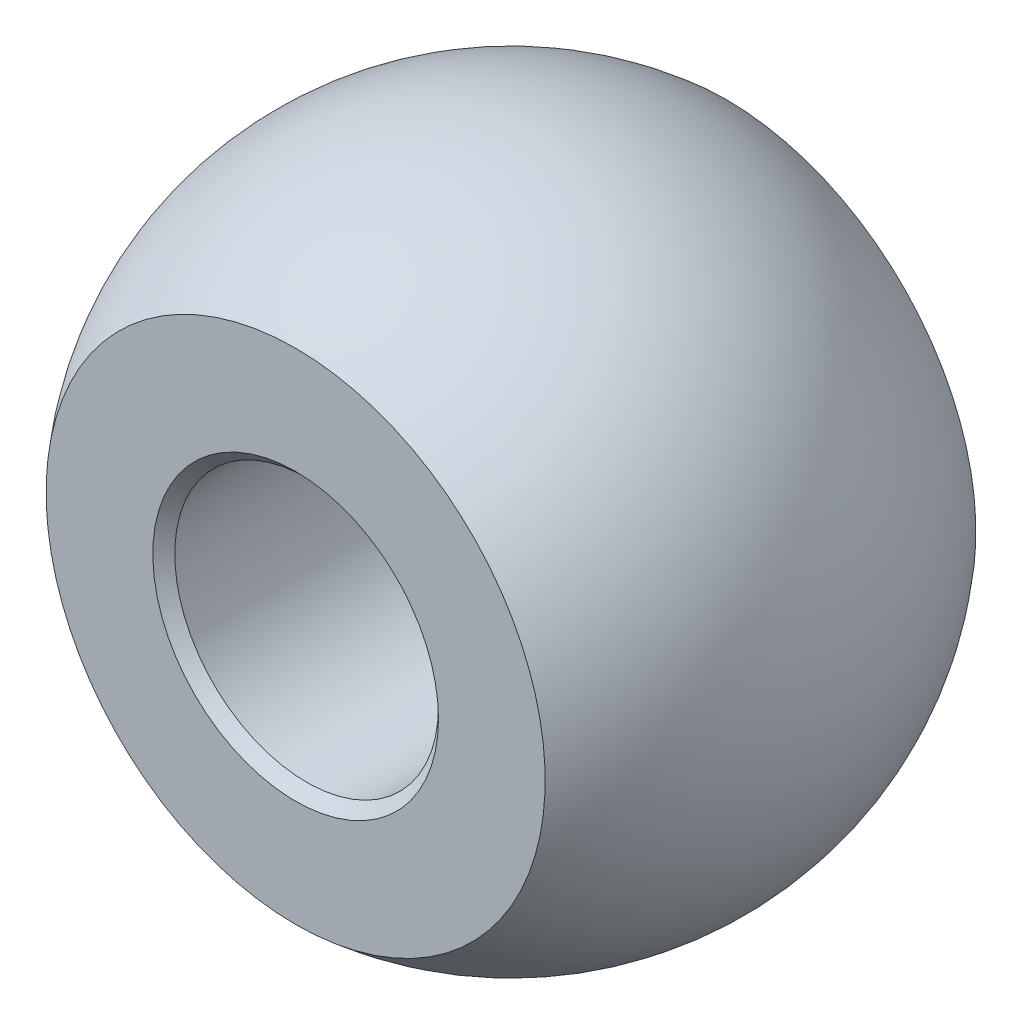
ISO-10303-21;
HEADER;
FILE_DESCRIPTION(('STEP AP214'),'2;1');
FILE_NAME('part.step','',(''),(''),'','','');
FILE_SCHEMA(('AUTOMOTIVE_DESIGN { 1 0 10303 214 1 1 1 1 }'));
ENDSEC;
DATA;
#1=APPLICATION_CONTEXT('core data for automotive mechanical design processes');
#2=APPLICATION_PROTOCOL_DEFINITION('international standard','automotive_design',2000,#1);
#3=PRODUCT_CONTEXT('',#1,'mechanical');
#4=PRODUCT('Part','Part','',(#3));
#5=PRODUCT_RELATED_PRODUCT_CATEGORY('part','',(#4));
#6=PRODUCT_DEFINITION_FORMATION('','',#4);
#7=PRODUCT_DEFINITION_CONTEXT('part definition',#1,'design');
#8=PRODUCT_DEFINITION('design','',#6,#7);
#9=PRODUCT_DEFINITION_SHAPE('','',#8);
#10=(LENGTH_UNIT() NAMED_UNIT(*) SI_UNIT(.MILLI.,.METRE.));
#11=(NAMED_UNIT(*) PLANE_ANGLE_UNIT() SI_UNIT($,.RADIAN.));
#12=(NAMED_UNIT(*) SI_UNIT($,.STERADIAN.) SOLID_ANGLE_UNIT());
#13=UNCERTAINTY_MEASURE_WITH_UNIT(LENGTH_MEASURE(1.E-05),#10,'distance_accuracy_value','');
#14=(GEOMETRIC_REPRESENTATION_CONTEXT(3) GLOBAL_UNCERTAINTY_ASSIGNED_CONTEXT((#13)) GLOBAL_UNIT_ASSIGNED_CONTEXT((#10,
#11,#12)) REPRESENTATION_CONTEXT('',''));
#15=CARTESIAN_POINT('',(0.,0.,0.));
#16=DIRECTION('',(0.,0.,1.));
#17=DIRECTION('',(1.,0.,0.));
#18=AXIS2_PLACEMENT_3D('',#15,#16,#17);
#19=CARTESIAN_POINT('',(0.,3.75,0.));
#20=DIRECTION('',(0.,-1.,0.));
#21=DIRECTION('',(-1.,0.,0.));
#22=AXIS2_PLACEMENT_3D('',#19,#20,#21);
#23=SPHERICAL_SURFACE('',#22,3.75);
#24=CARTESIAN_POINT('',(0.,3.75,0.));
#25=DIRECTION('',(0.,0.,-1.));
#26=DIRECTION('',(0.,1.,0.));
#27=AXIS2_PLACEMENT_3D('',#24,#25,#26);
#28=SPHERICAL_SURFACE('',#27,3.75);
#29=CARTESIAN_POINT('',(0.,3.75,2.45));
#30=DIRECTION('',(0.,0.,-1.));
#31=DIRECTION('',(0.,1.,0.));
#32=AXIS2_PLACEMENT_3D('',#29,#30,#31);
#33=CIRCLE('',#32,2.83901391331568);
#34=CARTESIAN_POINT('',(0.,6.58901391331568,2.45));
#35=VERTEX_POINT('',#34);
#36=EDGE_CURVE('E75',#35,#35,#33,.F.);
#37=ORIENTED_EDGE('',*,*,#36,.F.);
#38=EDGE_LOOP('',(#37));
#39=FACE_BOUND('',#38,.T.);
#40=CARTESIAN_POINT('',(0.,3.75,-2.45));
#41=DIRECTION('',(0.,0.,1.));
#42=DIRECTION('',(0.,-1.,0.));
#43=AXIS2_PLACEMENT_3D('',#40,#41,#42);
#44=CIRCLE('',#43,2.83901391331568);
#45=CARTESIAN_POINT('',(0.,0.910986086684321,-2.45));
#46=VERTEX_POINT('',#45);
#47=EDGE_CURVE('E78',#46,#46,#44,.F.);
#48=ORIENTED_EDGE('',*,*,#47,.F.);
#49=EDGE_LOOP('',(#48));
#50=FACE_BOUND('',#49,.T.);
#51=ADVANCED_FACE('F46',(#39,#50),#28,.T.);
#52=CARTESIAN_POINT('',(-3.75,7.6,-2.45));
#53=DIRECTION('',(0.,0.,1.));
#54=DIRECTION('',(0.,-1.,0.));
#55=AXIS2_PLACEMENT_3D('',#52,#53,#54);
#56=PLANE('',#55);
#57=CARTESIAN_POINT('',(0.,3.75,-2.45));
#58=DIRECTION('',(0.,0.,1.));
#59=DIRECTION('',(0.,-1.,0.));
#60=AXIS2_PLACEMENT_3D('',#57,#58,#59);
#61=CIRCLE('',#60,1.62499999999999);
#62=CARTESIAN_POINT('',(0.,2.12500000000001,-2.45));
#63=VERTEX_POINT('',#62);
#64=EDGE_CURVE('E70',#63,#63,#61,.T.);
#65=ORIENTED_EDGE('',*,*,#64,.T.);
#66=EDGE_LOOP('',(#65));
#67=FACE_BOUND('',#66,.T.);
#68=ORIENTED_EDGE('',*,*,#47,.T.);
#69=EDGE_LOOP('',(#68));
#70=FACE_BOUND('',#69,.T.);
#71=ADVANCED_FACE('F83',(#67,#70),#56,.F.);
#72=CARTESIAN_POINT('',(-3.75,7.6,2.45));
#73=DIRECTION('',(0.,0.,-1.));
#74=DIRECTION('',(0.,1.,0.));
#75=AXIS2_PLACEMENT_3D('',#72,#73,#74);
#76=PLANE('',#75);
#77=CARTESIAN_POINT('',(0.,3.75,2.45));
#78=DIRECTION('',(0.,0.,-1.));
#79=DIRECTION('',(0.,1.,0.));
#80=AXIS2_PLACEMENT_3D('',#77,#78,#79);
#81=CIRCLE('',#80,1.62500000000001);
#82=CARTESIAN_POINT('',(0.,5.37500000000001,2.45));
#83=VERTEX_POINT('',#82);
#84=EDGE_CURVE('E10',#83,#83,#81,.T.);
#85=ORIENTED_EDGE('',*,*,#84,.T.);
#86=EDGE_LOOP('',(#85));
#87=FACE_BOUND('',#86,.T.);
#88=ORIENTED_EDGE('',*,*,#36,.T.);
#89=EDGE_LOOP('',(#88));
#90=FACE_BOUND('',#89,.T.);
#91=ADVANCED_FACE('F91',(#87,#90),#76,.F.);
#92=CARTESIAN_POINT('',(0.,3.75,-2.45));
#93=DIRECTION('',(0.,0.,1.));
#94=DIRECTION('',(1.,0.,0.));
#95=AXIS2_PLACEMENT_3D('',#92,#93,#94);
#96=CYLINDRICAL_SURFACE('',#95,1.5);
#97=CARTESIAN_POINT('',(0.,3.75,-2.32500000000001));
#98=DIRECTION('',(0.,0.,1.));
#99=DIRECTION('',(1.,0.,0.));
#100=AXIS2_PLACEMENT_3D('',#97,#98,#99);
#101=CIRCLE('',#100,1.5);
#102=CARTESIAN_POINT('',(1.5,3.75,-2.32500000000001));
#103=VERTEX_POINT('',#102);
#104=EDGE_CURVE('E55',#103,#103,#101,.F.);
#105=CARTESIAN_POINT('',(0.,3.75,2.32499999999999));
#106=DIRECTION('',(0.,0.,-1.));
#107=DIRECTION('',(-1.,0.,0.));
#108=AXIS2_PLACEMENT_3D('',#105,#106,#107);
#109=CIRCLE('',#108,1.5);
#110=CARTESIAN_POINT('',(1.5,3.75,2.32499999999999));
#111=VERTEX_POINT('',#110);
#112=EDGE_CURVE('E63',#111,#111,#109,.F.);
#113=CARTESIAN_POINT('',(1.5,3.75,-2.32500000000001));
#114=CARTESIAN_POINT('',(1.5,3.75,-2.27656250000001));
#115=CARTESIAN_POINT('',(1.5,3.75,-2.22812500000001));
#116=CARTESIAN_POINT('',(1.5,3.75,-2.13125000000001));
#117=CARTESIAN_POINT('',(1.5,3.75,-2.08281250000001));
#118=CARTESIAN_POINT('',(1.5,3.75,-1.98593750000001));
#119=CARTESIAN_POINT('',(1.5,3.75,-1.93750000000001));
#120=CARTESIAN_POINT('',(1.5,3.75,-1.84062500000001));
#121=CARTESIAN_POINT('',(1.5,3.75,-1.79218750000001));
#122=CARTESIAN_POINT('',(1.5,3.75,-1.69531250000001));
#123=CARTESIAN_POINT('',(1.5,3.75,-1.64687500000001));
#124=CARTESIAN_POINT('',(1.5,3.75,-1.55000000000001));
#125=CARTESIAN_POINT('',(1.5,3.75,-1.50156250000001));
#126=CARTESIAN_POINT('',(1.5,3.75,-1.40468750000001));
#127=CARTESIAN_POINT('',(1.5,3.75,-1.35625000000001));
#128=CARTESIAN_POINT('',(1.5,3.75,-1.25937500000001));
#129=CARTESIAN_POINT('',(1.5,3.75,-1.21093750000001));
#130=CARTESIAN_POINT('',(1.5,3.75,-1.11406250000001));
#131=CARTESIAN_POINT('',(1.5,3.75,-1.06562500000001));
#132=CARTESIAN_POINT('',(1.5,3.75,-0.968750000000007));
#133=CARTESIAN_POINT('',(1.5,3.75,-0.920312500000007));
#134=CARTESIAN_POINT('',(1.5,3.75,-0.823437500000007));
#135=CARTESIAN_POINT('',(1.5,3.75,-0.775000000000007));
#136=CARTESIAN_POINT('',(1.5,3.75,-0.678125000000007));
#137=CARTESIAN_POINT('',(1.5,3.75,-0.629687500000007));
#138=CARTESIAN_POINT('',(1.5,3.75,-0.532812500000007));
#139=CARTESIAN_POINT('',(1.5,3.75,-0.484375000000007));
#140=CARTESIAN_POINT('',(1.5,3.75,-0.387500000000007));
#141=CARTESIAN_POINT('',(1.5,3.75,-0.339062500000007));
#142=CARTESIAN_POINT('',(1.5,3.75,-0.242187500000007));
#143=CARTESIAN_POINT('',(1.5,3.75,-0.193750000000007));
#144=CARTESIAN_POINT('',(1.5,3.75,-0.0968750000000075));
#145=CARTESIAN_POINT('',(1.5,3.75,-0.0484375000000077));
#146=CARTESIAN_POINT('',(1.5,3.75,0.0484374999999924));
#147=CARTESIAN_POINT('',(1.5,3.75,0.0968749999999925));
#148=CARTESIAN_POINT('',(1.5,3.75,0.193749999999993));
#149=CARTESIAN_POINT('',(1.5,3.75,0.242187499999992));
#150=CARTESIAN_POINT('',(1.5,3.75,0.339062499999992));
#151=CARTESIAN_POINT('',(1.5,3.75,0.387499999999992));
#152=CARTESIAN_POINT('',(1.5,3.75,0.484374999999992));
#153=CARTESIAN_POINT('',(1.5,3.75,0.532812499999992));
#154=CARTESIAN_POINT('',(1.5,3.75,0.629687499999992));
#155=CARTESIAN_POINT('',(1.5,3.75,0.678124999999992));
#156=CARTESIAN_POINT('',(1.5,3.75,0.774999999999992));
#157=CARTESIAN_POINT('',(1.5,3.75,0.823437499999992));
#158=CARTESIAN_POINT('',(1.5,3.75,0.920312499999991));
#159=CARTESIAN_POINT('',(1.5,3.75,0.968749999999991));
#160=CARTESIAN_POINT('',(1.5,3.75,1.06562499999999));
#161=CARTESIAN_POINT('',(1.5,3.75,1.11406249999999));
#162=CARTESIAN_POINT('',(1.5,3.75,1.21093749999999));
#163=CARTESIAN_POINT('',(1.5,3.75,1.25937499999999));
#164=CARTESIAN_POINT('',(1.5,3.75,1.35624999999999));
#165=CARTESIAN_POINT('',(1.5,3.75,1.40468749999999));
#166=CARTESIAN_POINT('',(1.5,3.75,1.50156249999999));
#167=CARTESIAN_POINT('',(1.5,3.75,1.54999999999999));
#168=CARTESIAN_POINT('',(1.5,3.75,1.64687499999999));
#169=CARTESIAN_POINT('',(1.5,3.75,1.69531249999999));
#170=CARTESIAN_POINT('',(1.5,3.75,1.79218749999999));
#171=CARTESIAN_POINT('',(1.5,3.75,1.84062499999999));
#172=CARTESIAN_POINT('',(1.5,3.75,1.93749999999999));
#173=CARTESIAN_POINT('',(1.5,3.75,1.98593749999999));
#174=CARTESIAN_POINT('',(1.5,3.75,2.08281249999999));
#175=CARTESIAN_POINT('',(1.5,3.75,2.13124999999999));
#176=CARTESIAN_POINT('',(1.5,3.75,2.22812499999999));
#177=CARTESIAN_POINT('',(1.5,3.75,2.27656249999999));
#178=CARTESIAN_POINT('',(1.5,3.75,2.32499999999999));
#179=B_SPLINE_CURVE_WITH_KNOTS('',3,(#113,#114,#115,#116,#117,#118,#119,#120,#121,#122,#123,
#124,#125,#126,#127,#128,#129,#130,#131,#132,#133,#134,#135,#136,#137,#138,#139,#140,#141,#142,
#143,#144,#145,#146,#147,#148,#149,#150,#151,#152,#153,#154,#155,#156,#157,#158,#159,#160,#161,
#162,#163,#164,#165,#166,#167,#168,#169,#170,#171,#172,#173,#174,#175,#176,#177,#178),
.UNSPECIFIED.,.F.,.F.,(4,2,2,2,2,2,2,2,2,2,2,2,2,2,2,2,2,2,2,2,2,2,2,2,2,2,2,2,2,2,2,2,4),(0.,
0.1453125,0.290625,0.4359375,0.58125,0.726562499999999,0.871874999999999,1.0171875,1.1625,
1.3078125,1.453125,1.5984375,1.74375,1.8890625,2.034375,2.1796875,2.325,2.4703125,2.615625,
2.7609375,2.90625,3.0515625,3.196875,3.3421875,3.4875,3.6328125,3.778125,3.9234375,4.06875,
4.2140625,4.359375,4.5046875,4.65),.UNSPECIFIED.);
#180=EDGE_CURVE('BSEAM101',#103,#111,#179,.T.);
#181=ORIENTED_EDGE('',*,*,#104,.T.);
#182=ORIENTED_EDGE('',*,*,#112,.T.);
#183=ORIENTED_EDGE('',*,*,#180,.T.);
#184=ORIENTED_EDGE('',*,*,#180,.F.);
#185=EDGE_LOOP('',(#181,#183,#182,#184));
#186=FACE_BOUND('',#185,.T.);
#187=ADVANCED_FACE('F101',(#186),#96,.F.);
#188=CARTESIAN_POINT('',(0.,3.75,-2.45));
#189=DIRECTION('',(0.,0.,-1.));
#190=DIRECTION('',(-1.,0.,0.));
#191=AXIS2_PLACEMENT_3D('',#188,#189,#190);
#192=CONICAL_SURFACE('',#191,1.62499999999999,0.785398163397442);
#193=ORIENTED_EDGE('',*,*,#104,.F.);
#194=EDGE_LOOP('',(#193));
#195=FACE_BOUND('',#194,.T.);
#196=ORIENTED_EDGE('',*,*,#64,.F.);
#197=EDGE_LOOP('',(#196));
#198=FACE_BOUND('',#197,.T.);
#199=ADVANCED_FACE('F97',(#195,#198),#192,.F.);
#200=CARTESIAN_POINT('',(0.,3.75,2.32499999999999));
#201=DIRECTION('',(0.,0.,1.));
#202=DIRECTION('',(1.,0.,0.));
#203=AXIS2_PLACEMENT_3D('',#200,#201,#202);
#204=CONICAL_SURFACE('',#203,1.5,0.785398163397459);
#205=ORIENTED_EDGE('',*,*,#84,.F.);
#206=EDGE_LOOP('',(#205));
#207=FACE_BOUND('',#206,.T.);
#208=ORIENTED_EDGE('',*,*,#112,.F.);
#209=EDGE_LOOP('',(#208));
#210=FACE_BOUND('',#209,.T.);
#211=ADVANCED_FACE('F49',(#207,#210),#204,.F.);
#212=CLOSED_SHELL('',(#51,#71,#91,#187,#199,#211));
#213=MANIFOLD_SOLID_BREP('B2',#212);
#214=ADVANCED_BREP_SHAPE_REPRESENTATION('',(#18,#213),#14);
#215=SHAPE_DEFINITION_REPRESENTATION(#9,#214);
ENDSEC;
END-ISO-10303-21;
